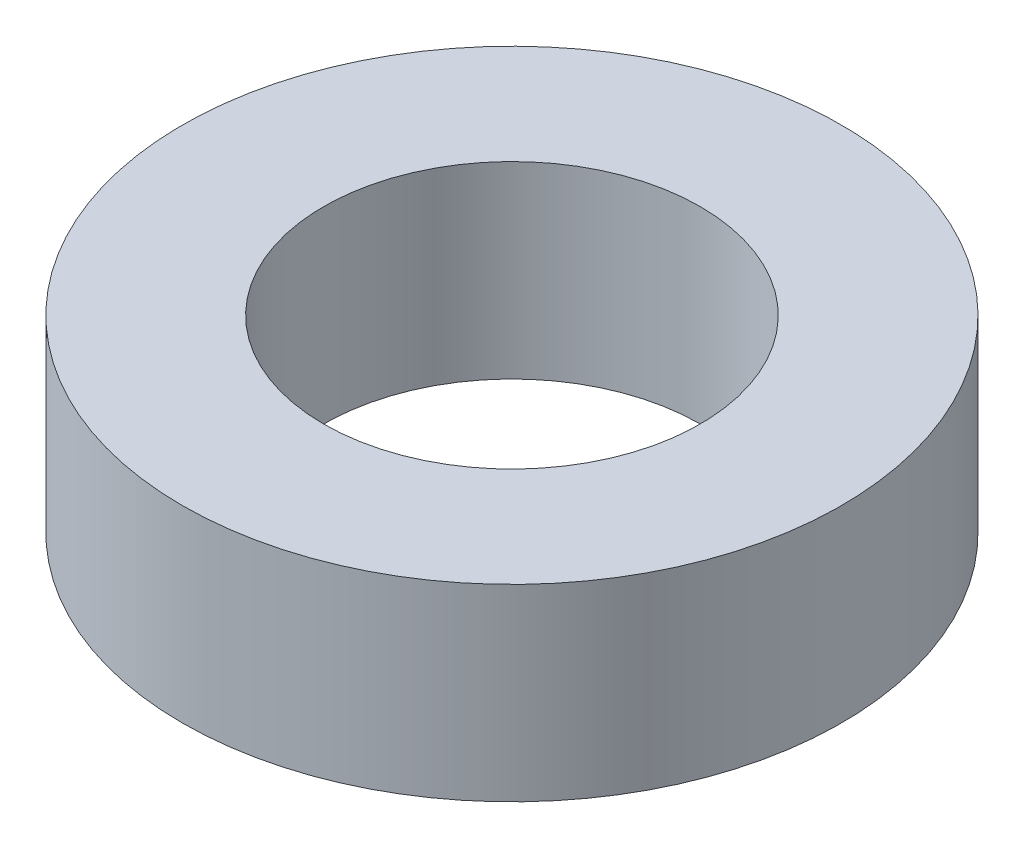
ISO-10303-21;
HEADER;
FILE_DESCRIPTION(('STEP AP214'),'2;1');
FILE_NAME('part.step','',(''),(''),'','','');
FILE_SCHEMA(('AUTOMOTIVE_DESIGN { 1 0 10303 214 1 1 1 1 }'));
ENDSEC;
DATA;
#1=APPLICATION_CONTEXT('core data for automotive mechanical design processes');
#2=APPLICATION_PROTOCOL_DEFINITION('international standard','automotive_design',2000,#1);
#3=PRODUCT_CONTEXT('',#1,'mechanical');
#4=PRODUCT('Part','Part','',(#3));
#5=PRODUCT_RELATED_PRODUCT_CATEGORY('part','',(#4));
#6=PRODUCT_DEFINITION_FORMATION('','',#4);
#7=PRODUCT_DEFINITION_CONTEXT('part definition',#1,'design');
#8=PRODUCT_DEFINITION('design','',#6,#7);
#9=PRODUCT_DEFINITION_SHAPE('','',#8);
#10=(LENGTH_UNIT() NAMED_UNIT(*) SI_UNIT(.MILLI.,.METRE.));
#11=(NAMED_UNIT(*) PLANE_ANGLE_UNIT() SI_UNIT($,.RADIAN.));
#12=(NAMED_UNIT(*) SI_UNIT($,.STERADIAN.) SOLID_ANGLE_UNIT());
#13=UNCERTAINTY_MEASURE_WITH_UNIT(LENGTH_MEASURE(1.E-05),#10,'distance_accuracy_value','');
#14=(GEOMETRIC_REPRESENTATION_CONTEXT(3) GLOBAL_UNCERTAINTY_ASSIGNED_CONTEXT((#13)) GLOBAL_UNIT_ASSIGNED_CONTEXT((#10,
#11,#12)) REPRESENTATION_CONTEXT('',''));
#15=CARTESIAN_POINT('',(0.,0.,0.));
#16=DIRECTION('',(0.,0.,1.));
#17=DIRECTION('',(1.,0.,0.));
#18=AXIS2_PLACEMENT_3D('',#15,#16,#17);
#19=CARTESIAN_POINT('',(0.,6.35,0.));
#20=DIRECTION('',(0.,-1.,0.));
#21=DIRECTION('',(0.,0.,-1.));
#22=AXIS2_PLACEMENT_3D('',#19,#20,#21);
#23=CYLINDRICAL_SURFACE('',#22,11.1125);
#24=CARTESIAN_POINT('',(0.,6.35,0.));
#25=DIRECTION('',(0.,1.,0.));
#26=DIRECTION('',(0.,0.,1.));
#27=AXIS2_PLACEMENT_3D('',#24,#25,#26);
#28=CIRCLE('',#27,11.1125);
#29=CARTESIAN_POINT('',(0.,6.35,11.1125));
#30=VERTEX_POINT('',#29);
#31=EDGE_CURVE('E10',#30,#30,#28,.T.);
#32=ORIENTED_EDGE('',*,*,#31,.F.);
#33=EDGE_LOOP('',(#32));
#34=FACE_BOUND('',#33,.T.);
#35=CARTESIAN_POINT('',(0.,0.,0.));
#36=DIRECTION('',(0.,1.,0.));
#37=DIRECTION('',(0.,0.,1.));
#38=AXIS2_PLACEMENT_3D('',#35,#36,#37);
#39=CIRCLE('',#38,11.1125);
#40=CARTESIAN_POINT('',(0.,0.,11.1125));
#41=VERTEX_POINT('',#40);
#42=EDGE_CURVE('E34',#41,#41,#39,.T.);
#43=ORIENTED_EDGE('',*,*,#42,.T.);
#44=EDGE_LOOP('',(#43));
#45=FACE_BOUND('',#44,.T.);
#46=ADVANCED_FACE('F31',(#34,#45),#23,.T.);
#47=CARTESIAN_POINT('',(0.,6.35,0.));
#48=DIRECTION('',(0.,1.,0.));
#49=DIRECTION('',(0.,0.,1.));
#50=AXIS2_PLACEMENT_3D('',#47,#48,#49);
#51=PLANE('',#50);
#52=CARTESIAN_POINT('',(0.,6.35,0.));
#53=DIRECTION('',(0.,1.,0.));
#54=DIRECTION('',(0.,0.,1.));
#55=AXIS2_PLACEMENT_3D('',#52,#53,#54);
#56=CIRCLE('',#55,6.35);
#57=CARTESIAN_POINT('',(0.,6.35,6.35));
#58=VERTEX_POINT('',#57);
#59=EDGE_CURVE('E43',#58,#58,#56,.T.);
#60=ORIENTED_EDGE('',*,*,#59,.F.);
#61=EDGE_LOOP('',(#60));
#62=FACE_BOUND('',#61,.T.);
#63=ORIENTED_EDGE('',*,*,#31,.T.);
#64=EDGE_LOOP('',(#63));
#65=FACE_BOUND('',#64,.T.);
#66=ADVANCED_FACE('F58',(#62,#65),#51,.T.);
#67=CARTESIAN_POINT('',(0.,0.,0.));
#68=DIRECTION('',(0.,1.,0.));
#69=DIRECTION('',(0.,0.,1.));
#70=AXIS2_PLACEMENT_3D('',#67,#68,#69);
#71=PLANE('',#70);
#72=CARTESIAN_POINT('',(0.,0.,0.));
#73=DIRECTION('',(0.,1.,0.));
#74=DIRECTION('',(0.,0.,1.));
#75=AXIS2_PLACEMENT_3D('',#72,#73,#74);
#76=CIRCLE('',#75,6.35);
#77=CARTESIAN_POINT('',(0.,0.,6.35));
#78=VERTEX_POINT('',#77);
#79=EDGE_CURVE('E41',#78,#78,#76,.T.);
#80=ORIENTED_EDGE('',*,*,#79,.T.);
#81=EDGE_LOOP('',(#80));
#82=FACE_BOUND('',#81,.T.);
#83=ORIENTED_EDGE('',*,*,#42,.F.);
#84=EDGE_LOOP('',(#83));
#85=FACE_BOUND('',#84,.T.);
#86=ADVANCED_FACE('F49',(#82,#85),#71,.F.);
#87=CARTESIAN_POINT('',(0.,0.,0.));
#88=DIRECTION('',(0.,1.,0.));
#89=DIRECTION('',(0.,0.,1.));
#90=AXIS2_PLACEMENT_3D('',#87,#88,#89);
#91=CYLINDRICAL_SURFACE('',#90,6.35);
#92=ORIENTED_EDGE('',*,*,#79,.F.);
#93=EDGE_LOOP('',(#92));
#94=FACE_BOUND('',#93,.T.);
#95=ORIENTED_EDGE('',*,*,#59,.T.);
#96=EDGE_LOOP('',(#95));
#97=FACE_BOUND('',#96,.T.);
#98=ADVANCED_FACE('F52',(#94,#97),#91,.F.);
#99=CLOSED_SHELL('',(#46,#66,#86,#98));
#100=MANIFOLD_SOLID_BREP('B2',#99);
#101=ADVANCED_BREP_SHAPE_REPRESENTATION('',(#18,#100),#14);
#102=SHAPE_DEFINITION_REPRESENTATION(#9,#101);
ENDSEC;
END-ISO-10303-21;
